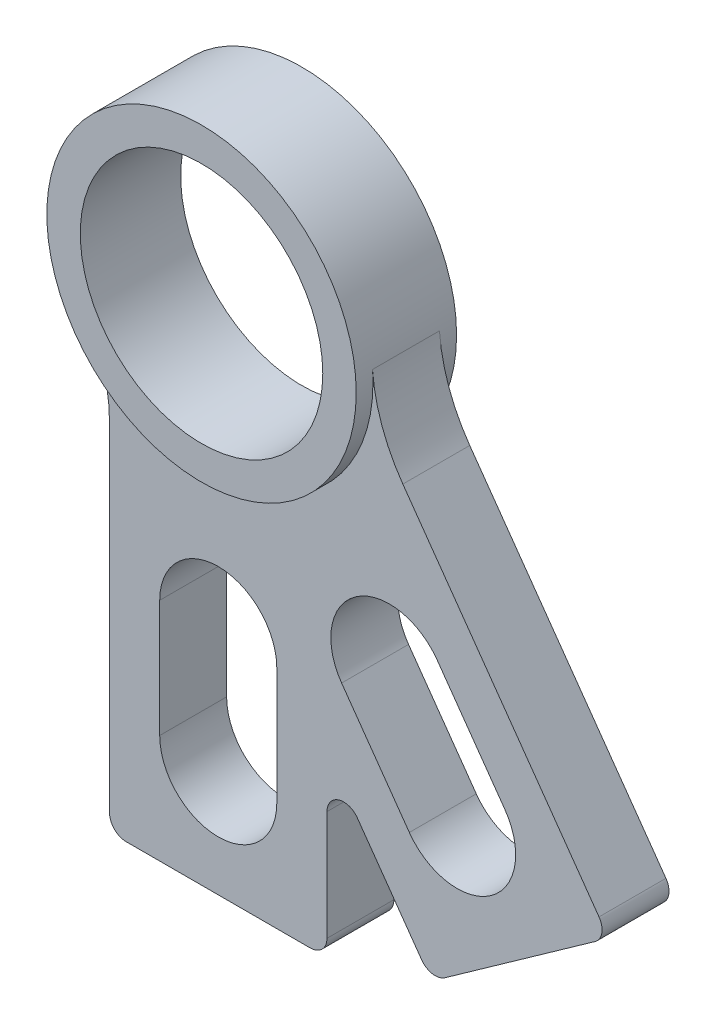
ISO-10303-21;
HEADER;
FILE_DESCRIPTION(('STEP AP214'),'2;1');
FILE_NAME('part.step','',(''),(''),'','','');
FILE_SCHEMA(('AUTOMOTIVE_DESIGN { 1 0 10303 214 1 1 1 1 }'));
ENDSEC;
DATA;
#1=APPLICATION_CONTEXT('core data for automotive mechanical design processes');
#2=APPLICATION_PROTOCOL_DEFINITION('international standard','automotive_design',2000,#1);
#3=PRODUCT_CONTEXT('',#1,'mechanical');
#4=PRODUCT('Part','Part','',(#3));
#5=PRODUCT_RELATED_PRODUCT_CATEGORY('part','',(#4));
#6=PRODUCT_DEFINITION_FORMATION('','',#4);
#7=PRODUCT_DEFINITION_CONTEXT('part definition',#1,'design');
#8=PRODUCT_DEFINITION('design','',#6,#7);
#9=PRODUCT_DEFINITION_SHAPE('','',#8);
#10=(LENGTH_UNIT() NAMED_UNIT(*) SI_UNIT(.MILLI.,.METRE.));
#11=(NAMED_UNIT(*) PLANE_ANGLE_UNIT() SI_UNIT($,.RADIAN.));
#12=(NAMED_UNIT(*) SI_UNIT($,.STERADIAN.) SOLID_ANGLE_UNIT());
#13=UNCERTAINTY_MEASURE_WITH_UNIT(LENGTH_MEASURE(1.E-05),#10,'distance_accuracy_value','');
#14=(GEOMETRIC_REPRESENTATION_CONTEXT(3) GLOBAL_UNCERTAINTY_ASSIGNED_CONTEXT((#13)) GLOBAL_UNIT_ASSIGNED_CONTEXT((#10,
#11,#12)) REPRESENTATION_CONTEXT('',''));
#15=CARTESIAN_POINT('',(0.,0.,0.));
#16=DIRECTION('',(0.,0.,1.));
#17=DIRECTION('',(1.,0.,0.));
#18=AXIS2_PLACEMENT_3D('',#15,#16,#17);
#19=CARTESIAN_POINT('',(0.,-27.9580697939255,-4.76249999999999));
#20=DIRECTION('',(0.,0.,1.));
#21=DIRECTION('',(0.999999999999999,0.,0.));
#22=AXIS2_PLACEMENT_3D('',#19,#20,#21);
#23=CYLINDRICAL_SURFACE('',#22,5.55624999999843);
#24=CARTESIAN_POINT('',(0.,-27.9580697939255,3.175));
#25=DIRECTION('',(0.,0.,1.));
#26=DIRECTION('',(0.999999999999999,0.,0.));
#27=AXIS2_PLACEMENT_3D('',#24,#25,#26);
#28=CIRCLE('',#27,5.55624999999843);
#29=CARTESIAN_POINT('',(5.55624999999837,-27.9580697939254,3.17499999999999));
#30=VERTEX_POINT('',#29);
#31=CARTESIAN_POINT('',(-5.55624999999846,-27.9580697939255,3.175));
#32=VERTEX_POINT('',#31);
#33=EDGE_CURVE('E350',#30,#32,#28,.T.);
#34=ORIENTED_EDGE('',*,*,#33,.T.);
#35=DIRECTION('',(0.,0.,1.));
#36=VECTOR('',#35,1.);
#37=CARTESIAN_POINT('',(-5.55624999999846,-27.9580697939254,-4.7625));
#38=LINE('',#37,#36);
#39=CARTESIAN_POINT('',(-5.55624999999846,-27.9580697939254,-3.175));
#40=VERTEX_POINT('',#39);
#41=EDGE_CURVE('E249',#40,#32,#38,.T.);
#42=ORIENTED_EDGE('',*,*,#41,.F.);
#43=CARTESIAN_POINT('',(0.,-27.9580697939255,-3.175));
#44=DIRECTION('',(0.,0.,1.));
#45=DIRECTION('',(0.999999999999999,0.,0.));
#46=AXIS2_PLACEMENT_3D('',#43,#44,#45);
#47=CIRCLE('',#46,5.55624999999843);
#48=CARTESIAN_POINT('',(5.55624999999837,-27.9580697939254,-3.175));
#49=VERTEX_POINT('',#48);
#50=EDGE_CURVE('E388',#49,#40,#47,.T.);
#51=ORIENTED_EDGE('',*,*,#50,.F.);
#52=DIRECTION('',(0.,0.,1.));
#53=VECTOR('',#52,1.);
#54=CARTESIAN_POINT('',(5.55624999999837,-27.9580697939254,-4.7625));
#55=LINE('',#54,#53);
#56=EDGE_CURVE('E220',#49,#30,#55,.T.);
#57=ORIENTED_EDGE('',*,*,#56,.T.);
#58=EDGE_LOOP('',(#34,#42,#51,#57));
#59=FACE_BOUND('',#58,.T.);
#60=ADVANCED_FACE('F46',(#59),#23,.F.);
#61=CARTESIAN_POINT('',(-5.55624999999847,1.11022302462516E-13,-4.7625));
#62=DIRECTION('',(0.999999999999999,0.,0.));
#63=DIRECTION('',(0.,1.,0.));
#64=AXIS2_PLACEMENT_3D('',#61,#62,#63);
#65=PLANE('',#64);
#66=ORIENTED_EDGE('',*,*,#41,.T.);
#67=DIRECTION('',(0.,1.,0.));
#68=VECTOR('',#67,1.);
#69=CARTESIAN_POINT('',(-5.55624999999844,0.,3.175));
#70=LINE('',#69,#68);
#71=CARTESIAN_POINT('',(-5.55624999999851,-39.0705697939287,3.175));
#72=VERTEX_POINT('',#71);
#73=EDGE_CURVE('E356',#72,#32,#70,.T.);
#74=ORIENTED_EDGE('',*,*,#73,.F.);
#75=DIRECTION('',(0.,0.,1.));
#76=VECTOR('',#75,1.);
#77=CARTESIAN_POINT('',(-5.55624999999847,-39.0705697939287,-4.7625));
#78=LINE('',#77,#76);
#79=CARTESIAN_POINT('',(-5.55624999999847,-39.0705697939287,-3.175));
#80=VERTEX_POINT('',#79);
#81=EDGE_CURVE('E435',#80,#72,#78,.T.);
#82=ORIENTED_EDGE('',*,*,#81,.F.);
#83=DIRECTION('',(0.,-1.,0.));
#84=VECTOR('',#83,1.);
#85=CARTESIAN_POINT('',(-5.55624999999844,0.,-3.175));
#86=LINE('',#85,#84);
#87=EDGE_CURVE('E391',#40,#80,#86,.T.);
#88=ORIENTED_EDGE('',*,*,#87,.F.);
#89=EDGE_LOOP('',(#66,#74,#82,#88));
#90=FACE_BOUND('',#89,.T.);
#91=ADVANCED_FACE('F434',(#90),#65,.T.);
#92=CARTESIAN_POINT('',(0.,-39.0705697939286,-4.7625));
#93=DIRECTION('',(0.,0.,1.));
#94=DIRECTION('',(0.999999999999999,0.,0.));
#95=AXIS2_PLACEMENT_3D('',#92,#93,#94);
#96=CYLINDRICAL_SURFACE('',#95,5.55624999999845);
#97=CARTESIAN_POINT('',(0.,-39.0705697939286,3.175));
#98=DIRECTION('',(0.,0.,1.));
#99=DIRECTION('',(0.999999999999999,0.,0.));
#100=AXIS2_PLACEMENT_3D('',#97,#98,#99);
#101=CIRCLE('',#100,5.55624999999845);
#102=CARTESIAN_POINT('',(5.5562499999984,-39.0705697939288,3.175));
#103=VERTEX_POINT('',#102);
#104=EDGE_CURVE('E359',#72,#103,#101,.T.);
#105=ORIENTED_EDGE('',*,*,#104,.T.);
#106=DIRECTION('',(0.,0.,1.));
#107=VECTOR('',#106,1.);
#108=CARTESIAN_POINT('',(5.55624999999847,-39.0705697939288,-4.7625));
#109=LINE('',#108,#107);
#110=CARTESIAN_POINT('',(5.55624999999847,-39.0705697939288,-3.175));
#111=VERTEX_POINT('',#110);
#112=EDGE_CURVE('E224',#111,#103,#109,.T.);
#113=ORIENTED_EDGE('',*,*,#112,.F.);
#114=CARTESIAN_POINT('',(0.,-39.0705697939286,-3.175));
#115=DIRECTION('',(0.,0.,1.));
#116=DIRECTION('',(0.999999999999999,0.,0.));
#117=AXIS2_PLACEMENT_3D('',#114,#115,#116);
#118=CIRCLE('',#117,5.55624999999845);
#119=EDGE_CURVE('E385',#80,#111,#118,.T.);
#120=ORIENTED_EDGE('',*,*,#119,.F.);
#121=ORIENTED_EDGE('',*,*,#81,.T.);
#122=EDGE_LOOP('',(#105,#113,#120,#121));
#123=FACE_BOUND('',#122,.T.);
#124=ADVANCED_FACE('F444',(#123),#96,.F.);
#125=CARTESIAN_POINT('',(16.2411710413153,-22.9127804627995,-4.7625));
#126=DIRECTION('',(0.,0.,1.));
#127=DIRECTION('',(0.999999999999999,0.,0.));
#128=AXIS2_PLACEMENT_3D('',#125,#126,#127);
#129=CYLINDRICAL_SURFACE('',#128,5.55624999999839);
#130=CARTESIAN_POINT('',(16.241171041315,-22.912780462799,3.175));
#131=DIRECTION('',(0.,0.,1.));
#132=DIRECTION('',(0.999999999999999,0.,0.));
#133=AXIS2_PLACEMENT_3D('',#130,#131,#132);
#134=CIRCLE('',#133,5.5562499999984);
#135=CARTESIAN_POINT('',(20.7741537748645,-19.6996851327747,3.17499999999999));
#136=VERTEX_POINT('',#135);
#137=CARTESIAN_POINT('',(11.7081883077657,-26.1258757928237,3.175));
#138=VERTEX_POINT('',#137);
#139=EDGE_CURVE('E198',#136,#138,#134,.T.);
#140=ORIENTED_EDGE('',*,*,#139,.T.);
#141=DIRECTION('',(0.,0.,1.));
#142=VECTOR('',#141,1.);
#143=CARTESIAN_POINT('',(11.708188307766,-26.1258757928241,-4.7625));
#144=LINE('',#143,#142);
#145=CARTESIAN_POINT('',(11.7081883077657,-26.1258757928237,-3.175));
#146=VERTEX_POINT('',#145);
#147=EDGE_CURVE('E212',#146,#138,#144,.T.);
#148=ORIENTED_EDGE('',*,*,#147,.F.);
#149=CARTESIAN_POINT('',(16.241171041315,-22.912780462799,-3.175));
#150=DIRECTION('',(0.,0.,1.));
#151=DIRECTION('',(0.999999999999999,0.,0.));
#152=AXIS2_PLACEMENT_3D('',#149,#150,#151);
#153=CIRCLE('',#152,5.5562499999984);
#154=CARTESIAN_POINT('',(20.7741537748642,-19.6996851327744,-3.175));
#155=VERTEX_POINT('',#154);
#156=EDGE_CURVE('E378',#155,#146,#153,.T.);
#157=ORIENTED_EDGE('',*,*,#156,.F.);
#158=DIRECTION('',(0.,0.,1.));
#159=VECTOR('',#158,1.);
#160=CARTESIAN_POINT('',(20.7741537748645,-19.6996851327747,-4.7625));
#161=LINE('',#160,#159);
#162=EDGE_CURVE('E214',#155,#136,#161,.T.);
#163=ORIENTED_EDGE('',*,*,#162,.T.);
#164=EDGE_LOOP('',(#140,#148,#157,#163));
#165=FACE_BOUND('',#164,.T.);
#166=ADVANCED_FACE('F210',(#165),#129,.F.);
#167=CARTESIAN_POINT('',(-4.53298273354927,-3.21309533002451,-4.7625));
#168=DIRECTION('',(0.815834912675016,0.578284873795389,0.));
#169=DIRECTION('',(-0.578284873795388,0.815834912675017,0.));
#170=AXIS2_PLACEMENT_3D('',#167,#168,#169);
#171=PLANE('',#170);
#172=ORIENTED_EDGE('',*,*,#147,.T.);
#173=DIRECTION('',(-0.578284873795388,0.815834912675017,0.));
#174=VECTOR('',#173,1.);
#175=CARTESIAN_POINT('',(-4.53298273354928,-3.21309533002456,3.175));
#176=LINE('',#175,#174);
#177=CARTESIAN_POINT('',(18.1343789678188,-35.1918412599274,3.175));
#178=VERTEX_POINT('',#177);
#179=EDGE_CURVE('E195',#178,#138,#176,.T.);
#180=ORIENTED_EDGE('',*,*,#179,.F.);
#181=DIRECTION('',(0.,0.,1.));
#182=VECTOR('',#181,1.);
#183=CARTESIAN_POINT('',(18.1343789678191,-35.1918412599278,-4.7625));
#184=LINE('',#183,#182);
#185=CARTESIAN_POINT('',(18.1343789678188,-35.1918412599274,-3.175));
#186=VERTEX_POINT('',#185);
#187=EDGE_CURVE('E221',#186,#178,#184,.T.);
#188=ORIENTED_EDGE('',*,*,#187,.F.);
#189=DIRECTION('',(0.578284873795388,-0.815834912675017,0.));
#190=VECTOR('',#189,1.);
#191=CARTESIAN_POINT('',(-4.53298273354928,-3.21309533002456,-3.175));
#192=LINE('',#191,#190);
#193=EDGE_CURVE('E219',#146,#186,#192,.T.);
#194=ORIENTED_EDGE('',*,*,#193,.F.);
#195=EDGE_LOOP('',(#172,#180,#188,#194));
#196=FACE_BOUND('',#195,.T.);
#197=ADVANCED_FACE('F218',(#196),#171,.T.);
#198=CARTESIAN_POINT('',(22.6673617013684,-31.9787459299032,-4.7625));
#199=DIRECTION('',(0.,0.,1.));
#200=DIRECTION('',(0.999999999999999,0.,0.));
#201=AXIS2_PLACEMENT_3D('',#198,#199,#200);
#202=CYLINDRICAL_SURFACE('',#201,5.55624999999839);
#203=CARTESIAN_POINT('',(22.6673617013681,-31.9787459299027,3.175));
#204=DIRECTION('',(0.,0.,1.));
#205=DIRECTION('',(0.999999999999999,0.,0.));
#206=AXIS2_PLACEMENT_3D('',#203,#204,#205);
#207=CIRCLE('',#206,5.5562499999984);
#208=CARTESIAN_POINT('',(27.2003444349173,-28.765650599878,3.175));
#209=VERTEX_POINT('',#208);
#210=EDGE_CURVE('E201',#178,#209,#207,.T.);
#211=ORIENTED_EDGE('',*,*,#210,.T.);
#212=DIRECTION('',(0.,0.,1.));
#213=VECTOR('',#212,1.);
#214=CARTESIAN_POINT('',(27.2003444349176,-28.7656505998785,-4.7625));
#215=LINE('',#214,#213);
#216=CARTESIAN_POINT('',(27.2003444349176,-28.7656505998785,-3.175));
#217=VERTEX_POINT('',#216);
#218=EDGE_CURVE('E226',#217,#209,#215,.T.);
#219=ORIENTED_EDGE('',*,*,#218,.F.);
#220=CARTESIAN_POINT('',(22.6673617013681,-31.9787459299027,-3.175));
#221=DIRECTION('',(0.,0.,1.));
#222=DIRECTION('',(0.999999999999999,0.,0.));
#223=AXIS2_PLACEMENT_3D('',#220,#221,#222);
#224=CIRCLE('',#223,5.5562499999984);
#225=EDGE_CURVE('E414',#186,#217,#224,.T.);
#226=ORIENTED_EDGE('',*,*,#225,.F.);
#227=ORIENTED_EDGE('',*,*,#187,.T.);
#228=EDGE_LOOP('',(#211,#219,#226,#227));
#229=FACE_BOUND('',#228,.T.);
#230=ADVANCED_FACE('F468',(#229),#202,.F.);
#231=CARTESIAN_POINT('',(30.468694880166,2.31084199789683,-4.7625));
#232=DIRECTION('',(0.,0.,1.));
#233=DIRECTION('',(0.999999999999999,0.,0.));
#234=AXIS2_PLACEMENT_3D('',#231,#232,#233);
#235=CYLINDRICAL_SURFACE('',#234,15.8749999999984);
#236=DIRECTION('',(0.,0.,1.));
#237=VECTOR('',#236,1.);
#238=CARTESIAN_POINT('',(14.6391568085926,1.11027986266365,-4.7625));
#239=LINE('',#238,#237);
#240=CARTESIAN_POINT('',(14.6391568085926,1.11027986266365,-3.175));
#241=VERTEX_POINT('',#240);
#242=CARTESIAN_POINT('',(14.6391568085927,1.11027986266365,3.175));
#243=VERTEX_POINT('',#242);
#244=EDGE_CURVE('E233',#241,#243,#239,.T.);
#245=ORIENTED_EDGE('',*,*,#244,.T.);
#246=CARTESIAN_POINT('',(30.4686948801661,2.31084199789666,3.175));
#247=DIRECTION('',(0.,0.,1.));
#248=DIRECTION('',(0.999999999999999,0.,0.));
#249=AXIS2_PLACEMENT_3D('',#246,#247,#248);
#250=CIRCLE('',#249,15.8749999999984);
#251=CARTESIAN_POINT('',(17.5173156414515,-6.86943037360405,3.175));
#252=VERTEX_POINT('',#251);
#253=EDGE_CURVE('E365',#243,#252,#250,.T.);
#254=ORIENTED_EDGE('',*,*,#253,.T.);
#255=DIRECTION('',(0.,0.,1.));
#256=VECTOR('',#255,1.);
#257=CARTESIAN_POINT('',(17.5173156414513,-6.86943037360377,-4.7625));
#258=LINE('',#257,#256);
#259=CARTESIAN_POINT('',(17.5173156414515,-6.86943037360405,-3.175));
#260=VERTEX_POINT('',#259);
#261=EDGE_CURVE('E236',#260,#252,#258,.T.);
#262=ORIENTED_EDGE('',*,*,#261,.F.);
#263=CARTESIAN_POINT('',(30.4686948801661,2.31084199789666,-3.175));
#264=DIRECTION('',(0.,0.,1.));
#265=DIRECTION('',(0.999999999999999,0.,0.));
#266=AXIS2_PLACEMENT_3D('',#263,#264,#265);
#267=CIRCLE('',#266,15.8749999999984);
#268=EDGE_CURVE('E326',#241,#260,#267,.T.);
#269=ORIENTED_EDGE('',*,*,#268,.F.);
#270=EDGE_LOOP('',(#245,#254,#262,#269));
#271=FACE_BOUND('',#270,.T.);
#272=ADVANCED_FACE('F471',(#271),#235,.F.);
#273=CARTESIAN_POINT('',(8.41839650516396,5.96717704147537,-4.7625));
#274=DIRECTION('',(0.815834912675016,0.578284873795389,0.));
#275=DIRECTION('',(-0.578284873795389,0.815834912675016,0.));
#276=AXIS2_PLACEMENT_3D('',#273,#274,#275);
#277=PLANE('',#276);
#278=DIRECTION('',(0.578284873795387,-0.815834912675017,0.));
#279=VECTOR('',#278,1.);
#280=CARTESIAN_POINT('',(8.41839650516403,5.96717704147526,3.175));
#281=LINE('',#280,#279);
#282=CARTESIAN_POINT('',(36.1349080108574,-33.1348274697203,3.175));
#283=VERTEX_POINT('',#282);
#284=EDGE_CURVE('E650',#252,#283,#281,.T.);
#285=ORIENTED_EDGE('',*,*,#284,.T.);
#286=DIRECTION('',(0.,0.,1.));
#287=VECTOR('',#286,1.);
#288=CARTESIAN_POINT('',(36.1349080108574,-33.1348274697203,-4.7625));
#289=LINE('',#288,#287);
#290=CARTESIAN_POINT('',(36.1349080108574,-33.1348274697203,-3.175));
#291=VERTEX_POINT('',#290);
#292=EDGE_CURVE('E270',#283,#291,#289,.F.);
#293=ORIENTED_EDGE('',*,*,#292,.T.);
#294=DIRECTION('',(-0.578284873795387,0.815834912675017,0.));
#295=VECTOR('',#294,1.);
#296=CARTESIAN_POINT('',(8.41839650516403,5.96717704147526,-3.175));
#297=LINE('',#296,#295);
#298=EDGE_CURVE('E324',#291,#260,#297,.T.);
#299=ORIENTED_EDGE('',*,*,#298,.T.);
#300=ORIENTED_EDGE('',*,*,#261,.T.);
#301=EDGE_LOOP('',(#285,#293,#299,#300));
#302=FACE_BOUND('',#301,.T.);
#303=ADVANCED_FACE('F479',(#302),#277,.T.);
#304=CARTESIAN_POINT('',(28.6345387428436,-40.3971424350671,-4.7625));
#305=DIRECTION('',(0.578284873795389,-0.815834912675016,0.));
#306=DIRECTION('',(0.815834912675016,0.57828487379539,0.));
#307=AXIS2_PLACEMENT_3D('',#304,#305,#306);
#308=PLANE('',#307);
#309=DIRECTION('',(0.815834912675017,0.578284873795389,0.));
#310=VECTOR('',#309,1.);
#311=CARTESIAN_POINT('',(28.6345387428433,-40.3971424350668,-3.175));
#312=LINE('',#311,#310);
#313=CARTESIAN_POINT('',(21.5112801615509,-45.4462922393918,-3.175));
#314=VERTEX_POINT('',#313);
#315=CARTESIAN_POINT('',(35.7577973241357,-35.3479926307417,-3.175));
#316=VERTEX_POINT('',#315);
#317=EDGE_CURVE('E316',#314,#316,#312,.T.);
#318=ORIENTED_EDGE('',*,*,#317,.T.);
#319=DIRECTION('',(0.,0.,1.));
#320=VECTOR('',#319,1.);
#321=CARTESIAN_POINT('',(35.757797324136,-35.3479926307421,-4.7625));
#322=LINE('',#321,#320);
#323=CARTESIAN_POINT('',(35.7577973241357,-35.3479926307417,3.175));
#324=VERTEX_POINT('',#323);
#325=EDGE_CURVE('E259',#316,#324,#322,.T.);
#326=ORIENTED_EDGE('',*,*,#325,.T.);
#327=DIRECTION('',(-0.815834912675017,-0.578284873795389,0.));
#328=VECTOR('',#327,1.);
#329=CARTESIAN_POINT('',(28.6345387428433,-40.3971424350668,3.175));
#330=LINE('',#329,#328);
#331=CARTESIAN_POINT('',(21.5112801615509,-45.4462922393918,3.175));
#332=VERTEX_POINT('',#331);
#333=EDGE_CURVE('E301',#324,#332,#330,.T.);
#334=ORIENTED_EDGE('',*,*,#333,.T.);
#335=DIRECTION('',(0.,0.,1.));
#336=VECTOR('',#335,1.);
#337=CARTESIAN_POINT('',(21.5112801615512,-45.4462922393923,-3.175));
#338=LINE('',#337,#336);
#339=EDGE_CURVE('E257',#332,#314,#338,.F.);
#340=ORIENTED_EDGE('',*,*,#339,.T.);
#341=EDGE_LOOP('',(#318,#326,#334,#340));
#342=FACE_BOUND('',#341,.T.);
#343=ADVANCED_FACE('F483',(#342),#308,.T.);
#344=CARTESIAN_POINT('',(-8.418396505164,-5.9671770414752,-4.7625));
#345=DIRECTION('',(0.815834912675017,0.578284873795389,0.));
#346=DIRECTION('',(-0.578284873795388,0.815834912675017,0.));
#347=AXIS2_PLACEMENT_3D('',#344,#345,#346);
#348=PLANE('',#347);
#349=DIRECTION('',(-0.578284873795387,0.815834912675017,0.));
#350=VECTOR('',#349,1.);
#351=CARTESIAN_POINT('',(-8.41839650516402,-5.9671770414752,3.175));
#352=LINE('',#351,#350);
#353=CARTESIAN_POINT('',(19.2981150005294,-45.0691815526709,3.175));
#354=VERTEX_POINT('',#353);
#355=CARTESIAN_POINT('',(13.20138792387,-36.4680179608496,3.175));
#356=VERTEX_POINT('',#355);
#357=EDGE_CURVE('E290',#354,#356,#352,.T.);
#358=ORIENTED_EDGE('',*,*,#357,.T.);
#359=DIRECTION('',(0.,0.,1.));
#360=VECTOR('',#359,1.);
#361=CARTESIAN_POINT('',(13.20138792387,-36.4680179608495,-3.175));
#362=LINE('',#361,#360);
#363=CARTESIAN_POINT('',(13.20138792387,-36.4680179608496,-3.175));
#364=VERTEX_POINT('',#363);
#365=EDGE_CURVE('E255',#356,#364,#362,.F.);
#366=ORIENTED_EDGE('',*,*,#365,.T.);
#367=DIRECTION('',(0.578284873795387,-0.815834912675017,0.));
#368=VECTOR('',#367,1.);
#369=CARTESIAN_POINT('',(-8.41839650516402,-5.9671770414752,-3.175));
#370=LINE('',#369,#368);
#371=CARTESIAN_POINT('',(19.2981150005294,-45.0691815526709,-3.175));
#372=VERTEX_POINT('',#371);
#373=EDGE_CURVE('E310',#364,#372,#370,.T.);
#374=ORIENTED_EDGE('',*,*,#373,.T.);
#375=DIRECTION('',(0.,0.,1.));
#376=VECTOR('',#375,1.);
#377=CARTESIAN_POINT('',(19.2981150005294,-45.0691815526708,3.175));
#378=LINE('',#377,#376);
#379=EDGE_CURVE('E252',#372,#354,#378,.T.);
#380=ORIENTED_EDGE('',*,*,#379,.T.);
#381=EDGE_LOOP('',(#358,#366,#374,#380));
#382=FACE_BOUND('',#381,.T.);
#383=ADVANCED_FACE('F297',(#382),#348,.F.);
#384=CARTESIAN_POINT('',(10.3187499999985,0.,-4.7625));
#385=DIRECTION('',(-0.999999999999999,0.,0.));
#386=DIRECTION('',(0.,-1.,0.));
#387=AXIS2_PLACEMENT_3D('',#384,#385,#386);
#388=PLANE('',#387);
#389=DIRECTION('',(0.,1.,0.));
#390=VECTOR('',#389,1.);
#391=CARTESIAN_POINT('',(10.3187499999985,1.11022302462516E-13,-3.175));
#392=LINE('',#391,#390);
#393=CARTESIAN_POINT('',(10.3187499999983,-47.8018197939271,-3.175));
#394=VERTEX_POINT('',#393);
#395=CARTESIAN_POINT('',(10.3187499999984,-37.3860451979998,-3.175));
#396=VERTEX_POINT('',#395);
#397=EDGE_CURVE('E309',#394,#396,#392,.T.);
#398=ORIENTED_EDGE('',*,*,#397,.T.);
#399=DIRECTION('',(0.,0.,1.));
#400=VECTOR('',#399,1.);
#401=CARTESIAN_POINT('',(10.3187499999984,-37.3860451979996,3.175));
#402=LINE('',#401,#400);
#403=CARTESIAN_POINT('',(10.3187499999984,-37.3860451979997,3.175));
#404=VERTEX_POINT('',#403);
#405=EDGE_CURVE('E248',#396,#404,#402,.T.);
#406=ORIENTED_EDGE('',*,*,#405,.T.);
#407=DIRECTION('',(0.,-1.,0.));
#408=VECTOR('',#407,1.);
#409=CARTESIAN_POINT('',(10.3187499999985,0.,3.175));
#410=LINE('',#409,#408);
#411=CARTESIAN_POINT('',(10.3187499999983,-47.8018197939271,3.175));
#412=VERTEX_POINT('',#411);
#413=EDGE_CURVE('E292',#404,#412,#410,.T.);
#414=ORIENTED_EDGE('',*,*,#413,.T.);
#415=DIRECTION('',(0.,0.,1.));
#416=VECTOR('',#415,1.);
#417=CARTESIAN_POINT('',(10.3187499999983,-47.8018197939271,-3.175));
#418=LINE('',#417,#416);
#419=EDGE_CURVE('E246',#412,#394,#418,.F.);
#420=ORIENTED_EDGE('',*,*,#419,.T.);
#421=EDGE_LOOP('',(#398,#406,#414,#420));
#422=FACE_BOUND('',#421,.T.);
#423=ADVANCED_FACE('F312',(#422),#388,.F.);
#424=CARTESIAN_POINT('',(0.,-49.3893197939272,-4.7625));
#425=DIRECTION('',(0.,-1.,0.));
#426=DIRECTION('',(0.999999999999999,0.,0.));
#427=AXIS2_PLACEMENT_3D('',#424,#425,#426);
#428=PLANE('',#427);
#429=DIRECTION('',(0.999999999999999,0.,0.));
#430=VECTOR('',#429,1.);
#431=CARTESIAN_POINT('',(0.,-49.3893197939272,-3.175));
#432=LINE('',#431,#430);
#433=CARTESIAN_POINT('',(-8.73124999999846,-49.3893197939271,-3.175));
#434=VERTEX_POINT('',#433);
#435=CARTESIAN_POINT('',(8.73124999999833,-49.3893197939271,-3.175));
#436=VERTEX_POINT('',#435);
#437=EDGE_CURVE('E314',#434,#436,#432,.T.);
#438=ORIENTED_EDGE('',*,*,#437,.T.);
#439=DIRECTION('',(0.,0.,1.));
#440=VECTOR('',#439,1.);
#441=CARTESIAN_POINT('',(8.73124999999834,-49.3893197939271,3.175));
#442=LINE('',#441,#440);
#443=CARTESIAN_POINT('',(8.73124999999834,-49.3893197939271,3.175));
#444=VERTEX_POINT('',#443);
#445=EDGE_CURVE('E280',#436,#444,#442,.T.);
#446=ORIENTED_EDGE('',*,*,#445,.T.);
#447=DIRECTION('',(-0.999999999999999,0.,0.));
#448=VECTOR('',#447,1.);
#449=CARTESIAN_POINT('',(0.,-49.3893197939272,3.175));
#450=LINE('',#449,#448);
#451=CARTESIAN_POINT('',(-8.73124999999846,-49.3893197939271,3.175));
#452=VERTEX_POINT('',#451);
#453=EDGE_CURVE('E403',#444,#452,#450,.T.);
#454=ORIENTED_EDGE('',*,*,#453,.T.);
#455=DIRECTION('',(0.,0.,1.));
#456=VECTOR('',#455,1.);
#457=CARTESIAN_POINT('',(-8.73124999999846,-49.3893197939271,-4.7625));
#458=LINE('',#457,#456);
#459=EDGE_CURVE('E68',#452,#434,#458,.F.);
#460=ORIENTED_EDGE('',*,*,#459,.T.);
#461=EDGE_LOOP('',(#438,#446,#454,#460));
#462=FACE_BOUND('',#461,.T.);
#463=ADVANCED_FACE('F406',(#462),#428,.T.);
#464=CARTESIAN_POINT('',(-10.3187499999984,0.,-4.7625));
#465=DIRECTION('',(-0.999999999999999,0.,0.));
#466=DIRECTION('',(0.,-1.,0.));
#467=AXIS2_PLACEMENT_3D('',#464,#465,#466);
#468=PLANE('',#467);
#469=DIRECTION('',(0.,-1.,0.));
#470=VECTOR('',#469,1.);
#471=CARTESIAN_POINT('',(-10.3187499999984,0.,-3.175));
#472=LINE('',#471,#470);
#473=CARTESIAN_POINT('',(-10.3187499999984,-15.734319793927,-3.175));
#474=VERTEX_POINT('',#473);
#475=CARTESIAN_POINT('',(-10.3187499999984,-47.8018197939271,-3.175));
#476=VERTEX_POINT('',#475);
#477=EDGE_CURVE('E318',#474,#476,#472,.T.);
#478=ORIENTED_EDGE('',*,*,#477,.T.);
#479=DIRECTION('',(0.,0.,1.));
#480=VECTOR('',#479,1.);
#481=CARTESIAN_POINT('',(-10.3187499999984,-47.8018197939271,-4.7625));
#482=LINE('',#481,#480);
#483=CARTESIAN_POINT('',(-10.3187499999984,-47.8018197939271,3.175));
#484=VERTEX_POINT('',#483);
#485=EDGE_CURVE('E283',#476,#484,#482,.T.);
#486=ORIENTED_EDGE('',*,*,#485,.T.);
#487=DIRECTION('',(0.,1.,0.));
#488=VECTOR('',#487,1.);
#489=CARTESIAN_POINT('',(-10.3187499999984,0.,3.175));
#490=LINE('',#489,#488);
#491=CARTESIAN_POINT('',(-10.3187499999984,-15.734319793927,3.175));
#492=VERTEX_POINT('',#491);
#493=EDGE_CURVE('E405',#484,#492,#490,.T.);
#494=ORIENTED_EDGE('',*,*,#493,.T.);
#495=DIRECTION('',(0.,0.,1.));
#496=VECTOR('',#495,1.);
#497=CARTESIAN_POINT('',(-10.3187499999984,-15.734319793927,-4.7625));
#498=LINE('',#497,#496);
#499=EDGE_CURVE('E239',#474,#492,#498,.T.);
#500=ORIENTED_EDGE('',*,*,#499,.F.);
#501=EDGE_LOOP('',(#478,#486,#494,#500));
#502=FACE_BOUND('',#501,.T.);
#503=ADVANCED_FACE('F396',(#502),#468,.T.);
#504=CARTESIAN_POINT('',(4.53298273354923,3.2130953300249,-4.7625));
#505=DIRECTION('',(0.815834912675016,0.578284873795389,0.));
#506=DIRECTION('',(-0.578284873795388,0.815834912675017,0.));
#507=AXIS2_PLACEMENT_3D('',#504,#505,#506);
#508=PLANE('',#507);
#509=DIRECTION('',(0.578284873795388,-0.815834912675017,0.));
#510=VECTOR('',#509,1.);
#511=CARTESIAN_POINT('',(4.53298273354923,3.2130953300249,3.175));
#512=LINE('',#511,#510);
#513=EDGE_CURVE('E215',#136,#209,#512,.T.);
#514=ORIENTED_EDGE('',*,*,#513,.F.);
#515=ORIENTED_EDGE('',*,*,#162,.F.);
#516=DIRECTION('',(-0.578284873795388,0.815834912675017,0.));
#517=VECTOR('',#516,1.);
#518=CARTESIAN_POINT('',(4.53298273354923,3.2130953300249,-3.175));
#519=LINE('',#518,#517);
#520=EDGE_CURVE('E382',#217,#155,#519,.T.);
#521=ORIENTED_EDGE('',*,*,#520,.F.);
#522=ORIENTED_EDGE('',*,*,#218,.T.);
#523=EDGE_LOOP('',(#514,#515,#521,#522));
#524=FACE_BOUND('',#523,.T.);
#525=ADVANCED_FACE('F420',(#524),#508,.F.);
#526=CARTESIAN_POINT('',(-26.1937499999968,-15.7343197939272,-4.7625));
#527=DIRECTION('',(0.,0.,1.));
#528=DIRECTION('',(0.999999999999999,0.,0.));
#529=AXIS2_PLACEMENT_3D('',#526,#527,#528);
#530=CYLINDRICAL_SURFACE('',#529,15.8749999999984);
#531=CARTESIAN_POINT('',(-26.1937499999968,-15.7343197939272,3.175));
#532=DIRECTION('',(0.,0.,1.));
#533=DIRECTION('',(0.999999999999999,0.,0.));
#534=AXIS2_PLACEMENT_3D('',#531,#532,#533);
#535=CIRCLE('',#534,15.8749999999984);
#536=CARTESIAN_POINT('',(-12.5851932668321,-7.55979787272665,3.175));
#537=VERTEX_POINT('',#536);
#538=EDGE_CURVE('E409',#492,#537,#535,.T.);
#539=ORIENTED_EDGE('',*,*,#538,.T.);
#540=DIRECTION('',(0.,0.,1.));
#541=VECTOR('',#540,1.);
#542=CARTESIAN_POINT('',(-12.5851932668321,-7.5597978727267,-4.7625));
#543=LINE('',#542,#541);
#544=CARTESIAN_POINT('',(-12.5851932668321,-7.55979787272665,-3.175));
#545=VERTEX_POINT('',#544);
#546=EDGE_CURVE('E242',#545,#537,#543,.T.);
#547=ORIENTED_EDGE('',*,*,#546,.F.);
#548=CARTESIAN_POINT('',(-26.1937499999968,-15.7343197939272,-3.175));
#549=DIRECTION('',(0.,0.,1.));
#550=DIRECTION('',(0.999999999999999,0.,0.));
#551=AXIS2_PLACEMENT_3D('',#548,#549,#550);
#552=CIRCLE('',#551,15.8749999999984);
#553=EDGE_CURVE('E332',#474,#545,#552,.T.);
#554=ORIENTED_EDGE('',*,*,#553,.F.);
#555=ORIENTED_EDGE('',*,*,#499,.T.);
#556=EDGE_LOOP('',(#539,#547,#554,#555));
#557=FACE_BOUND('',#556,.T.);
#558=ADVANCED_FACE('F474',(#557),#530,.F.);
#559=CARTESIAN_POINT('',(5.55624999999828,0.,-4.76249999999999));
#560=DIRECTION('',(0.999999999999999,0.,0.));
#561=DIRECTION('',(0.,1.,0.));
#562=AXIS2_PLACEMENT_3D('',#559,#560,#561);
#563=PLANE('',#562);
#564=DIRECTION('',(0.,-1.,0.));
#565=VECTOR('',#564,1.);
#566=CARTESIAN_POINT('',(5.55624999999826,0.,3.175));
#567=LINE('',#566,#565);
#568=EDGE_CURVE('E355',#30,#103,#567,.T.);
#569=ORIENTED_EDGE('',*,*,#568,.F.);
#570=ORIENTED_EDGE('',*,*,#56,.F.);
#571=DIRECTION('',(0.,1.,0.));
#572=VECTOR('',#571,1.);
#573=CARTESIAN_POINT('',(5.55624999999828,0.,-3.175));
#574=LINE('',#573,#572);
#575=EDGE_CURVE('E387',#111,#49,#574,.T.);
#576=ORIENTED_EDGE('',*,*,#575,.F.);
#577=ORIENTED_EDGE('',*,*,#112,.T.);
#578=EDGE_LOOP('',(#569,#570,#576,#577));
#579=FACE_BOUND('',#578,.T.);
#580=ADVANCED_FACE('F441',(#579),#563,.F.);
#581=CARTESIAN_POINT('',(0.,0.,4.7625));
#582=DIRECTION('',(0.,0.,1.));
#583=DIRECTION('',(0.999999999999999,0.,0.));
#584=AXIS2_PLACEMENT_3D('',#581,#582,#583);
#585=PLANE('',#584);
#586=CARTESIAN_POINT('',(0.,0.,4.7625));
#587=DIRECTION('',(0.,0.,1.));
#588=DIRECTION('',(0.999999999999999,0.,0.));
#589=AXIS2_PLACEMENT_3D('',#586,#587,#588);
#590=CIRCLE('',#589,11.5062);
#591=CARTESIAN_POINT('',(11.5062,0.,4.7625));
#592=VERTEX_POINT('',#591);
#593=EDGE_CURVE('E631',#592,#592,#590,.T.);
#594=ORIENTED_EDGE('',*,*,#593,.F.);
#595=EDGE_LOOP('',(#594));
#596=FACE_BOUND('',#595,.T.);
#597=CARTESIAN_POINT('',(0.,0.,4.7625));
#598=DIRECTION('',(0.,0.,1.));
#599=DIRECTION('',(0.999999999999999,0.,0.));
#600=AXIS2_PLACEMENT_3D('',#597,#598,#599);
#601=CIRCLE('',#600,14.6812);
#602=CARTESIAN_POINT('',(14.6812,0.,4.7625));
#603=VERTEX_POINT('',#602);
#604=EDGE_CURVE('E374',#603,#603,#601,.T.);
#605=ORIENTED_EDGE('',*,*,#604,.T.);
#606=EDGE_LOOP('',(#605));
#607=FACE_BOUND('',#606,.T.);
#608=ADVANCED_FACE('F502',(#596,#607),#585,.T.);
#609=CARTESIAN_POINT('',(0.,0.,-4.7625));
#610=DIRECTION('',(0.,0.,1.));
#611=DIRECTION('',(0.999999999999999,0.,0.));
#612=AXIS2_PLACEMENT_3D('',#609,#610,#611);
#613=CYLINDRICAL_SURFACE('',#612,14.6812);
#614=ORIENTED_EDGE('',*,*,#604,.F.);
#615=EDGE_LOOP('',(#614));
#616=FACE_BOUND('',#615,.T.);
#617=ORIENTED_EDGE('',*,*,#244,.F.);
#618=CARTESIAN_POINT('',(0.,0.,-3.175));
#619=DIRECTION('',(0.,0.,1.));
#620=DIRECTION('',(0.999999999999999,0.,0.));
#621=AXIS2_PLACEMENT_3D('',#618,#619,#620);
#622=CIRCLE('',#621,14.6812);
#623=EDGE_CURVE('E329',#545,#241,#622,.T.);
#624=ORIENTED_EDGE('',*,*,#623,.F.);
#625=ORIENTED_EDGE('',*,*,#546,.T.);
#626=CARTESIAN_POINT('',(0.,0.,3.175));
#627=DIRECTION('',(0.,0.,1.));
#628=DIRECTION('',(0.999999999999999,0.,0.));
#629=AXIS2_PLACEMENT_3D('',#626,#627,#628);
#630=CIRCLE('',#629,14.6812);
#631=EDGE_CURVE('E361',#537,#243,#630,.T.);
#632=ORIENTED_EDGE('',*,*,#631,.T.);
#633=EDGE_LOOP('',(#617,#624,#625,#632));
#634=FACE_BOUND('',#633,.T.);
#635=CARTESIAN_POINT('',(0.,0.,-4.7625));
#636=DIRECTION('',(0.,0.,1.));
#637=DIRECTION('',(0.999999999999999,0.,0.));
#638=AXIS2_PLACEMENT_3D('',#635,#636,#637);
#639=CIRCLE('',#638,14.6812);
#640=CARTESIAN_POINT('',(14.6812,0.,-4.7625));
#641=VERTEX_POINT('',#640);
#642=EDGE_CURVE('E245',#641,#641,#639,.T.);
#643=ORIENTED_EDGE('',*,*,#642,.T.);
#644=EDGE_LOOP('',(#643));
#645=FACE_BOUND('',#644,.T.);
#646=ADVANCED_FACE('F499',(#616,#634,#645),#613,.T.);
#647=CARTESIAN_POINT('',(0.,0.,-4.7625));
#648=DIRECTION('',(0.,0.,1.));
#649=DIRECTION('',(0.999999999999999,0.,0.));
#650=AXIS2_PLACEMENT_3D('',#647,#648,#649);
#651=CYLINDRICAL_SURFACE('',#650,11.5062);
#652=CARTESIAN_POINT('',(0.,0.,-4.7625));
#653=DIRECTION('',(0.,0.,1.));
#654=DIRECTION('',(0.999999999999999,0.,0.));
#655=AXIS2_PLACEMENT_3D('',#652,#653,#654);
#656=CIRCLE('',#655,11.5062);
#657=CARTESIAN_POINT('',(11.5062,0.,-4.7625));
#658=VERTEX_POINT('',#657);
#659=EDGE_CURVE('E369',#658,#658,#656,.T.);
#660=CARTESIAN_POINT('',(11.5062,0.,-4.7625));
#661=CARTESIAN_POINT('',(11.5062,0.,-4.66328125));
#662=CARTESIAN_POINT('',(11.5062,0.,-4.5640625));
#663=CARTESIAN_POINT('',(11.5062,0.,-4.365625));
#664=CARTESIAN_POINT('',(11.5062,0.,-4.26640625));
#665=CARTESIAN_POINT('',(11.5062,0.,-4.06796875));
#666=CARTESIAN_POINT('',(11.5062,0.,-3.96875));
#667=CARTESIAN_POINT('',(11.5062,0.,-3.7703125));
#668=CARTESIAN_POINT('',(11.5062,0.,-3.67109375));
#669=CARTESIAN_POINT('',(11.5062,0.,-3.47265625));
#670=CARTESIAN_POINT('',(11.5062,0.,-3.3734375));
#671=CARTESIAN_POINT('',(11.5062,0.,-3.175));
#672=CARTESIAN_POINT('',(11.5062,0.,-3.07578125));
#673=CARTESIAN_POINT('',(11.5062,0.,-2.87734375));
#674=CARTESIAN_POINT('',(11.5062,0.,-2.778125));
#675=CARTESIAN_POINT('',(11.5062,0.,-2.5796875));
#676=CARTESIAN_POINT('',(11.5062,0.,-2.48046875));
#677=CARTESIAN_POINT('',(11.5062,0.,-2.28203125));
#678=CARTESIAN_POINT('',(11.5062,0.,-2.1828125));
#679=CARTESIAN_POINT('',(11.5062,0.,-1.984375));
#680=CARTESIAN_POINT('',(11.5062,0.,-1.88515625));
#681=CARTESIAN_POINT('',(11.5062,0.,-1.68671875));
#682=CARTESIAN_POINT('',(11.5062,0.,-1.5875));
#683=CARTESIAN_POINT('',(11.5062,0.,-1.3890625));
#684=CARTESIAN_POINT('',(11.5062,0.,-1.28984375));
#685=CARTESIAN_POINT('',(11.5062,0.,-1.09140625));
#686=CARTESIAN_POINT('',(11.5062,0.,-0.992187499999997));
#687=CARTESIAN_POINT('',(11.5062,0.,-0.793749999999997));
#688=CARTESIAN_POINT('',(11.5062,0.,-0.694531249999997));
#689=CARTESIAN_POINT('',(11.5062,0.,-0.496093749999998));
#690=CARTESIAN_POINT('',(11.5062,0.,-0.396874999999998));
#691=CARTESIAN_POINT('',(11.5062,0.,-0.198437499999997));
#692=CARTESIAN_POINT('',(11.5062,0.,-0.0992187499999975));
#693=CARTESIAN_POINT('',(11.5062,0.,0.0992187500000027));
#694=CARTESIAN_POINT('',(11.5062,0.,0.198437500000003));
#695=CARTESIAN_POINT('',(11.5062,0.,0.396875000000003));
#696=CARTESIAN_POINT('',(11.5062,0.,0.496093750000003));
#697=CARTESIAN_POINT('',(11.5062,0.,0.694531250000003));
#698=CARTESIAN_POINT('',(11.5062,0.,0.793750000000003));
#699=CARTESIAN_POINT('',(11.5062,0.,0.992187500000003));
#700=CARTESIAN_POINT('',(11.5062,0.,1.09140625));
#701=CARTESIAN_POINT('',(11.5062,0.,1.28984375));
#702=CARTESIAN_POINT('',(11.5062,0.,1.3890625));
#703=CARTESIAN_POINT('',(11.5062,0.,1.5875));
#704=CARTESIAN_POINT('',(11.5062,0.,1.68671875));
#705=CARTESIAN_POINT('',(11.5062,0.,1.88515625));
#706=CARTESIAN_POINT('',(11.5062,0.,1.984375));
#707=CARTESIAN_POINT('',(11.5062,0.,2.1828125));
#708=CARTESIAN_POINT('',(11.5062,0.,2.28203125));
#709=CARTESIAN_POINT('',(11.5062,0.,2.48046875));
#710=CARTESIAN_POINT('',(11.5062,0.,2.5796875));
#711=CARTESIAN_POINT('',(11.5062,0.,2.778125));
#712=CARTESIAN_POINT('',(11.5062,0.,2.87734375));
#713=CARTESIAN_POINT('',(11.5062,0.,3.07578125));
#714=CARTESIAN_POINT('',(11.5062,0.,3.175));
#715=CARTESIAN_POINT('',(11.5062,0.,3.3734375));
#716=CARTESIAN_POINT('',(11.5062,0.,3.47265625));
#717=CARTESIAN_POINT('',(11.5062,0.,3.67109375));
#718=CARTESIAN_POINT('',(11.5062,0.,3.7703125));
#719=CARTESIAN_POINT('',(11.5062,0.,3.96875));
#720=CARTESIAN_POINT('',(11.5062,0.,4.06796875));
#721=CARTESIAN_POINT('',(11.5062,0.,4.26640625));
#722=CARTESIAN_POINT('',(11.5062,0.,4.365625));
#723=CARTESIAN_POINT('',(11.5062,0.,4.5640625));
#724=CARTESIAN_POINT('',(11.5062,0.,4.66328125));
#725=CARTESIAN_POINT('',(11.5062,0.,4.7625));
#726=B_SPLINE_CURVE_WITH_KNOTS('',3,(#660,#661,#662,#663,#664,#665,#666,#667,#668,#669,#670,
#671,#672,#673,#674,#675,#676,#677,#678,#679,#680,#681,#682,#683,#684,#685,#686,#687,#688,#689,
#690,#691,#692,#693,#694,#695,#696,#697,#698,#699,#700,#701,#702,#703,#704,#705,#706,#707,#708,
#709,#710,#711,#712,#713,#714,#715,#716,#717,#718,#719,#720,#721,#722,#723,#724,#725),
.UNSPECIFIED.,.F.,.F.,(4,2,2,2,2,2,2,2,2,2,2,2,2,2,2,2,2,2,2,2,2,2,2,2,2,2,2,2,2,2,2,2,4),(0.,
0.29765625,0.5953125,0.892968750000001,1.190625,1.48828125,1.7859375,2.08359375,2.38125,
2.67890625,2.9765625,3.27421875,3.571875,3.86953125,4.1671875,4.46484375,4.7625,5.06015625,
5.3578125,5.65546875,5.953125,6.25078125,6.5484375,6.84609375,7.14375,7.44140625,7.7390625,
8.03671875,8.334375,8.63203125,8.9296875,9.22734375,9.525),.UNSPECIFIED.);
#727=EDGE_CURVE('BSEAM453',#658,#592,#726,.T.);
#728=ORIENTED_EDGE('',*,*,#659,.F.);
#729=ORIENTED_EDGE('',*,*,#593,.T.);
#730=ORIENTED_EDGE('',*,*,#727,.T.);
#731=ORIENTED_EDGE('',*,*,#727,.F.);
#732=EDGE_LOOP('',(#728,#730,#729,#731));
#733=FACE_BOUND('',#732,.T.);
#734=ADVANCED_FACE('F453',(#733),#651,.F.);
#735=CARTESIAN_POINT('',(0.,0.,-4.7625));
#736=DIRECTION('',(0.,0.,1.));
#737=DIRECTION('',(0.999999999999999,0.,0.));
#738=AXIS2_PLACEMENT_3D('',#735,#736,#737);
#739=PLANE('',#738);
#740=ORIENTED_EDGE('',*,*,#659,.T.);
#741=EDGE_LOOP('',(#740));
#742=FACE_BOUND('',#741,.T.);
#743=ORIENTED_EDGE('',*,*,#642,.F.);
#744=EDGE_LOOP('',(#743));
#745=FACE_BOUND('',#744,.T.);
#746=ADVANCED_FACE('F446',(#742,#745),#739,.F.);
#747=CARTESIAN_POINT('',(30.4686948801661,2.31084199789666,-3.175));
#748=DIRECTION('',(0.,0.,1.));
#749=DIRECTION('',(0.999999999999999,0.,0.));
#750=AXIS2_PLACEMENT_3D('',#747,#748,#749);
#751=PLANE('',#750);
#752=ORIENTED_EDGE('',*,*,#298,.F.);
#753=CARTESIAN_POINT('',(34.8397700869858,-34.0528547068705,-3.175));
#754=DIRECTION('',(0.,0.,1.));
#755=DIRECTION('',(0.999999999999999,0.,0.));
#756=AXIS2_PLACEMENT_3D('',#753,#754,#755);
#757=CIRCLE('',#756,1.5875);
#758=EDGE_CURVE('E277',#291,#316,#757,.F.);
#759=ORIENTED_EDGE('',*,*,#758,.T.);
#760=ORIENTED_EDGE('',*,*,#317,.F.);
#761=CARTESIAN_POINT('',(20.593252924401,-44.1511543155207,-3.175));
#762=DIRECTION('',(0.,0.,1.));
#763=DIRECTION('',(0.999999999999999,0.,0.));
#764=AXIS2_PLACEMENT_3D('',#761,#762,#763);
#765=CIRCLE('',#764,1.5875);
#766=EDGE_CURVE('E275',#314,#372,#765,.F.);
#767=ORIENTED_EDGE('',*,*,#766,.T.);
#768=ORIENTED_EDGE('',*,*,#373,.F.);
#769=CARTESIAN_POINT('',(11.9062499999984,-37.3860451979996,-3.175));
#770=DIRECTION('',(0.,0.,1.));
#771=DIRECTION('',(0.999999999999999,0.,0.));
#772=AXIS2_PLACEMENT_3D('',#769,#770,#771);
#773=CIRCLE('',#772,1.5875);
#774=EDGE_CURVE('E12',#364,#396,#773,.T.);
#775=ORIENTED_EDGE('',*,*,#774,.T.);
#776=ORIENTED_EDGE('',*,*,#397,.F.);
#777=CARTESIAN_POINT('',(8.73124999999833,-47.8018197939271,-3.175));
#778=DIRECTION('',(0.,0.,1.));
#779=DIRECTION('',(0.999999999999999,0.,0.));
#780=AXIS2_PLACEMENT_3D('',#777,#778,#779);
#781=CIRCLE('',#780,1.5875);
#782=EDGE_CURVE('E61',#394,#436,#781,.F.);
#783=ORIENTED_EDGE('',*,*,#782,.T.);
#784=ORIENTED_EDGE('',*,*,#437,.F.);
#785=CARTESIAN_POINT('',(-8.73124999999847,-47.8018197939271,-3.175));
#786=DIRECTION('',(0.,0.,1.));
#787=DIRECTION('',(0.999999999999999,0.,0.));
#788=AXIS2_PLACEMENT_3D('',#785,#786,#787);
#789=CIRCLE('',#788,1.5875);
#790=EDGE_CURVE('E272',#434,#476,#789,.F.);
#791=ORIENTED_EDGE('',*,*,#790,.T.);
#792=ORIENTED_EDGE('',*,*,#477,.F.);
#793=ORIENTED_EDGE('',*,*,#553,.T.);
#794=ORIENTED_EDGE('',*,*,#623,.T.);
#795=ORIENTED_EDGE('',*,*,#268,.T.);
#796=EDGE_LOOP('',(#752,#759,#760,#767,#768,#775,#776,#783,#784,#791,#792,#793,#794,#795));
#797=FACE_BOUND('',#796,.T.);
#798=ORIENTED_EDGE('',*,*,#575,.T.);
#799=ORIENTED_EDGE('',*,*,#50,.T.);
#800=ORIENTED_EDGE('',*,*,#87,.T.);
#801=ORIENTED_EDGE('',*,*,#119,.T.);
#802=EDGE_LOOP('',(#798,#799,#800,#801));
#803=FACE_BOUND('',#802,.T.);
#804=ORIENTED_EDGE('',*,*,#520,.T.);
#805=ORIENTED_EDGE('',*,*,#156,.T.);
#806=ORIENTED_EDGE('',*,*,#193,.T.);
#807=ORIENTED_EDGE('',*,*,#225,.T.);
#808=EDGE_LOOP('',(#804,#805,#806,#807));
#809=FACE_BOUND('',#808,.T.);
#810=ADVANCED_FACE('F307',(#797,#803,#809),#751,.F.);
#811=CARTESIAN_POINT('',(0.,0.,3.175));
#812=DIRECTION('',(0.,0.,1.));
#813=DIRECTION('',(0.999999999999999,0.,0.));
#814=AXIS2_PLACEMENT_3D('',#811,#812,#813);
#815=PLANE('',#814);
#816=ORIENTED_EDGE('',*,*,#73,.T.);
#817=ORIENTED_EDGE('',*,*,#33,.F.);
#818=ORIENTED_EDGE('',*,*,#568,.T.);
#819=ORIENTED_EDGE('',*,*,#104,.F.);
#820=EDGE_LOOP('',(#816,#817,#818,#819));
#821=FACE_BOUND('',#820,.T.);
#822=ORIENTED_EDGE('',*,*,#333,.F.);
#823=CARTESIAN_POINT('',(34.8397700869858,-34.0528547068705,3.175));
#824=DIRECTION('',(0.,0.,1.));
#825=DIRECTION('',(0.999999999999999,0.,0.));
#826=AXIS2_PLACEMENT_3D('',#823,#824,#825);
#827=CIRCLE('',#826,1.5875);
#828=EDGE_CURVE('E268',#324,#283,#827,.T.);
#829=ORIENTED_EDGE('',*,*,#828,.T.);
#830=ORIENTED_EDGE('',*,*,#284,.F.);
#831=ORIENTED_EDGE('',*,*,#253,.F.);
#832=ORIENTED_EDGE('',*,*,#631,.F.);
#833=ORIENTED_EDGE('',*,*,#538,.F.);
#834=ORIENTED_EDGE('',*,*,#493,.F.);
#835=CARTESIAN_POINT('',(-8.73124999999847,-47.8018197939271,3.175));
#836=DIRECTION('',(0.,0.,1.));
#837=DIRECTION('',(0.999999999999999,0.,0.));
#838=AXIS2_PLACEMENT_3D('',#835,#836,#837);
#839=CIRCLE('',#838,1.5875);
#840=EDGE_CURVE('E262',#484,#452,#839,.T.);
#841=ORIENTED_EDGE('',*,*,#840,.T.);
#842=ORIENTED_EDGE('',*,*,#453,.F.);
#843=CARTESIAN_POINT('',(8.73124999999832,-47.8018197939271,3.175));
#844=DIRECTION('',(0.,0.,1.));
#845=DIRECTION('',(0.999999999999999,0.,0.));
#846=AXIS2_PLACEMENT_3D('',#843,#844,#845);
#847=CIRCLE('',#846,1.5875);
#848=EDGE_CURVE('E264',#444,#412,#847,.T.);
#849=ORIENTED_EDGE('',*,*,#848,.T.);
#850=ORIENTED_EDGE('',*,*,#413,.F.);
#851=CARTESIAN_POINT('',(11.9062499999984,-37.3860451979996,3.175));
#852=DIRECTION('',(0.,0.,1.));
#853=DIRECTION('',(0.999999999999999,0.,0.));
#854=AXIS2_PLACEMENT_3D('',#851,#852,#853);
#855=CIRCLE('',#854,1.5875);
#856=EDGE_CURVE('E54',#404,#356,#855,.F.);
#857=ORIENTED_EDGE('',*,*,#856,.T.);
#858=ORIENTED_EDGE('',*,*,#357,.F.);
#859=CARTESIAN_POINT('',(20.593252924401,-44.1511543155207,3.175));
#860=DIRECTION('',(0.,0.,1.));
#861=DIRECTION('',(0.999999999999999,0.,0.));
#862=AXIS2_PLACEMENT_3D('',#859,#860,#861);
#863=CIRCLE('',#862,1.5875);
#864=EDGE_CURVE('E266',#354,#332,#863,.T.);
#865=ORIENTED_EDGE('',*,*,#864,.T.);
#866=EDGE_LOOP('',(#822,#829,#830,#831,#832,#833,#834,#841,#842,#849,#850,#857,#858,#865));
#867=FACE_BOUND('',#866,.T.);
#868=ORIENTED_EDGE('',*,*,#179,.T.);
#869=ORIENTED_EDGE('',*,*,#139,.F.);
#870=ORIENTED_EDGE('',*,*,#513,.T.);
#871=ORIENTED_EDGE('',*,*,#210,.F.);
#872=EDGE_LOOP('',(#868,#869,#870,#871));
#873=FACE_BOUND('',#872,.T.);
#874=ADVANCED_FACE('F197',(#821,#867,#873),#815,.T.);
#875=CARTESIAN_POINT('',(11.9062499999984,-37.3860451979996,-4.7625));
#876=DIRECTION('',(0.,0.,-1.));
#877=DIRECTION('',(-0.999999999999999,0.,0.));
#878=AXIS2_PLACEMENT_3D('',#875,#876,#877);
#879=CYLINDRICAL_SURFACE('',#878,1.5875);
#880=ORIENTED_EDGE('',*,*,#774,.F.);
#881=ORIENTED_EDGE('',*,*,#365,.F.);
#882=ORIENTED_EDGE('',*,*,#856,.F.);
#883=ORIENTED_EDGE('',*,*,#405,.F.);
#884=EDGE_LOOP('',(#880,#881,#882,#883));
#885=FACE_BOUND('',#884,.T.);
#886=ADVANCED_FACE('F304',(#885),#879,.F.);
#887=CARTESIAN_POINT('',(34.8397700869858,-34.0528547068705,-4.7625));
#888=DIRECTION('',(0.,0.,1.));
#889=DIRECTION('',(0.999999999999999,0.,0.));
#890=AXIS2_PLACEMENT_3D('',#887,#888,#889);
#891=CYLINDRICAL_SURFACE('',#890,1.5875);
#892=ORIENTED_EDGE('',*,*,#758,.F.);
#893=ORIENTED_EDGE('',*,*,#292,.F.);
#894=ORIENTED_EDGE('',*,*,#828,.F.);
#895=ORIENTED_EDGE('',*,*,#325,.F.);
#896=EDGE_LOOP('',(#892,#893,#894,#895));
#897=FACE_BOUND('',#896,.T.);
#898=ADVANCED_FACE('F509',(#897),#891,.T.);
#899=CARTESIAN_POINT('',(20.593252924401,-44.1511543155207,-4.7625));
#900=DIRECTION('',(0.,0.,-1.));
#901=DIRECTION('',(-0.999999999999999,0.,0.));
#902=AXIS2_PLACEMENT_3D('',#899,#900,#901);
#903=CYLINDRICAL_SURFACE('',#902,1.5875);
#904=ORIENTED_EDGE('',*,*,#766,.F.);
#905=ORIENTED_EDGE('',*,*,#339,.F.);
#906=ORIENTED_EDGE('',*,*,#864,.F.);
#907=ORIENTED_EDGE('',*,*,#379,.F.);
#908=EDGE_LOOP('',(#904,#905,#906,#907));
#909=FACE_BOUND('',#908,.T.);
#910=ADVANCED_FACE('F512',(#909),#903,.T.);
#911=CARTESIAN_POINT('',(8.73124999999833,-47.8018197939271,-4.7625));
#912=DIRECTION('',(0.,0.,-1.));
#913=DIRECTION('',(-0.999999999999999,0.,0.));
#914=AXIS2_PLACEMENT_3D('',#911,#912,#913);
#915=CYLINDRICAL_SURFACE('',#914,1.5875);
#916=ORIENTED_EDGE('',*,*,#782,.F.);
#917=ORIENTED_EDGE('',*,*,#419,.F.);
#918=ORIENTED_EDGE('',*,*,#848,.F.);
#919=ORIENTED_EDGE('',*,*,#445,.F.);
#920=EDGE_LOOP('',(#916,#917,#918,#919));
#921=FACE_BOUND('',#920,.T.);
#922=ADVANCED_FACE('F515',(#921),#915,.T.);
#923=CARTESIAN_POINT('',(-8.73124999999847,-47.8018197939271,-4.7625));
#924=DIRECTION('',(0.,0.,1.));
#925=DIRECTION('',(0.999999999999999,0.,0.));
#926=AXIS2_PLACEMENT_3D('',#923,#924,#925);
#927=CYLINDRICAL_SURFACE('',#926,1.5875);
#928=ORIENTED_EDGE('',*,*,#790,.F.);
#929=ORIENTED_EDGE('',*,*,#459,.F.);
#930=ORIENTED_EDGE('',*,*,#840,.F.);
#931=ORIENTED_EDGE('',*,*,#485,.F.);
#932=EDGE_LOOP('',(#928,#929,#930,#931));
#933=FACE_BOUND('',#932,.T.);
#934=ADVANCED_FACE('F48',(#933),#927,.T.);
#935=CLOSED_SHELL('',(#60,#91,#124,#166,#197,#230,#272,#303,#343,#383,#423,#463,#503,#525,#558,
#580,#608,#646,#734,#746,#810,#874,#886,#898,#910,#922,#934));
#936=MANIFOLD_SOLID_BREP('B2',#935);
#937=ADVANCED_BREP_SHAPE_REPRESENTATION('',(#18,#936),#14);
#938=SHAPE_DEFINITION_REPRESENTATION(#9,#937);
ENDSEC;
END-ISO-10303-21;
